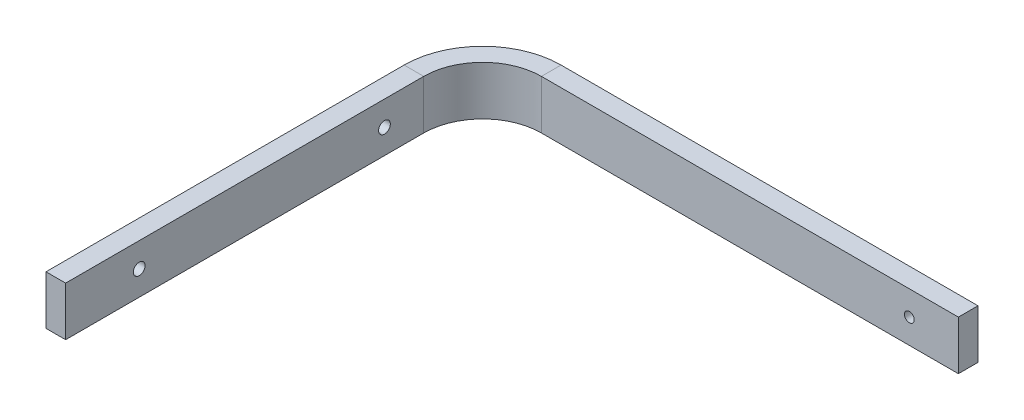
ISO-10303-21;
HEADER;
FILE_DESCRIPTION(('STEP AP214'),'2;1');
FILE_NAME('part.step','',(''),(''),'','','');
FILE_SCHEMA(('AUTOMOTIVE_DESIGN { 1 0 10303 214 1 1 1 1 }'));
ENDSEC;
DATA;
#1=APPLICATION_CONTEXT('core data for automotive mechanical design processes');
#2=APPLICATION_PROTOCOL_DEFINITION('international standard','automotive_design',2000,#1);
#3=PRODUCT_CONTEXT('',#1,'mechanical');
#4=PRODUCT('Part','Part','',(#3));
#5=PRODUCT_RELATED_PRODUCT_CATEGORY('part','',(#4));
#6=PRODUCT_DEFINITION_FORMATION('','',#4);
#7=PRODUCT_DEFINITION_CONTEXT('part definition',#1,'design');
#8=PRODUCT_DEFINITION('design','',#6,#7);
#9=PRODUCT_DEFINITION_SHAPE('','',#8);
#10=(LENGTH_UNIT() NAMED_UNIT(*) SI_UNIT(.MILLI.,.METRE.));
#11=(NAMED_UNIT(*) PLANE_ANGLE_UNIT() SI_UNIT($,.RADIAN.));
#12=(NAMED_UNIT(*) SI_UNIT($,.STERADIAN.) SOLID_ANGLE_UNIT());
#13=UNCERTAINTY_MEASURE_WITH_UNIT(LENGTH_MEASURE(1.E-05),#10,'distance_accuracy_value','');
#14=(GEOMETRIC_REPRESENTATION_CONTEXT(3) GLOBAL_UNCERTAINTY_ASSIGNED_CONTEXT((#13)) GLOBAL_UNIT_ASSIGNED_CONTEXT((#10,
#11,#12)) REPRESENTATION_CONTEXT('',''));
#15=CARTESIAN_POINT('',(0.,0.,0.));
#16=DIRECTION('',(0.,0.,1.));
#17=DIRECTION('',(1.,0.,0.));
#18=AXIS2_PLACEMENT_3D('',#15,#16,#17);
#19=CARTESIAN_POINT('',(-252.51106428109,-12.4999999999999,-227.488935718911));
#20=DIRECTION('',(-1.,0.,0.));
#21=DIRECTION('',(0.,0.,1.));
#22=AXIS2_PLACEMENT_3D('',#19,#20,#21);
#23=PLANE('',#22);
#24=CARTESIAN_POINT('',(-252.511064281089,0.,185.000000000001));
#25=DIRECTION('',(1.,0.,0.));
#26=DIRECTION('',(0.,0.,-1.));
#27=AXIS2_PLACEMENT_3D('',#24,#25,#26);
#28=CIRCLE('',#27,2.99999999999999);
#29=CARTESIAN_POINT('',(-252.511064281089,0.,182.000000000001));
#30=VERTEX_POINT('',#29);
#31=EDGE_CURVE('E199',#30,#30,#28,.T.);
#32=ORIENTED_EDGE('',*,*,#31,.T.);
#33=EDGE_LOOP('',(#32));
#34=FACE_BOUND('',#33,.T.);
#35=DIRECTION('',(0.,0.,1.));
#36=VECTOR('',#35,1.);
#37=CARTESIAN_POINT('',(-252.51106428109,12.4999999999999,-227.488935718911));
#38=LINE('',#37,#36);
#39=CARTESIAN_POINT('',(-252.511064281089,12.5,40.0000000000001));
#40=VERTEX_POINT('',#39);
#41=CARTESIAN_POINT('',(-252.511064281089,12.5,222.511064281089));
#42=VERTEX_POINT('',#41);
#43=EDGE_CURVE('E172',#40,#42,#38,.T.);
#44=ORIENTED_EDGE('',*,*,#43,.F.);
#45=DIRECTION('',(0.,-1.,0.));
#46=VECTOR('',#45,1.);
#47=CARTESIAN_POINT('',(-252.511064281089,-12.4999999999999,40.0000000000001));
#48=LINE('',#47,#46);
#49=CARTESIAN_POINT('',(-252.511064281089,-12.5,40.0000000000002));
#50=VERTEX_POINT('',#49);
#51=EDGE_CURVE('E11',#40,#50,#48,.T.);
#52=ORIENTED_EDGE('',*,*,#51,.T.);
#53=DIRECTION('',(0.,0.,-1.));
#54=VECTOR('',#53,1.);
#55=CARTESIAN_POINT('',(-252.51106428109,-12.4999999999999,-227.488935718911));
#56=LINE('',#55,#54);
#57=CARTESIAN_POINT('',(-252.511064281089,-12.5,222.511064281089));
#58=VERTEX_POINT('',#57);
#59=EDGE_CURVE('E171',#58,#50,#56,.T.);
#60=ORIENTED_EDGE('',*,*,#59,.F.);
#61=DIRECTION('',(0.,-1.,0.));
#62=VECTOR('',#61,1.);
#63=CARTESIAN_POINT('',(-252.511064281089,12.5,222.511064281089));
#64=LINE('',#63,#62);
#65=EDGE_CURVE('E169',#42,#58,#64,.T.);
#66=ORIENTED_EDGE('',*,*,#65,.F.);
#67=EDGE_LOOP('',(#44,#52,#60,#66));
#68=FACE_BOUND('',#67,.T.);
#69=CARTESIAN_POINT('',(-252.51106428109,0.,60.0000000000009));
#70=DIRECTION('',(1.,0.,0.));
#71=DIRECTION('',(0.,0.,-1.));
#72=AXIS2_PLACEMENT_3D('',#69,#70,#71);
#73=CIRCLE('',#72,3.00000000000001);
#74=CARTESIAN_POINT('',(-252.51106428109,0.,57.0000000000009));
#75=VERTEX_POINT('',#74);
#76=EDGE_CURVE('E205',#75,#75,#73,.T.);
#77=ORIENTED_EDGE('',*,*,#76,.T.);
#78=EDGE_LOOP('',(#77));
#79=FACE_BOUND('',#78,.T.);
#80=ADVANCED_FACE('F43',(#34,#68,#79),#23,.T.);
#81=CARTESIAN_POINT('',(-242.51106428109,-12.4999999999999,-227.488935718911));
#82=DIRECTION('',(-1.,0.,0.));
#83=DIRECTION('',(0.,0.,1.));
#84=AXIS2_PLACEMENT_3D('',#81,#82,#83);
#85=PLANE('',#84);
#86=DIRECTION('',(0.,-1.,0.));
#87=VECTOR('',#86,1.);
#88=CARTESIAN_POINT('',(-242.511064281089,-12.4999999999999,40.0000000000001));
#89=LINE('',#88,#87);
#90=CARTESIAN_POINT('',(-242.511064281089,12.5,40.0000000000001));
#91=VERTEX_POINT('',#90);
#92=CARTESIAN_POINT('',(-242.511064281089,-12.5,40.0000000000001));
#93=VERTEX_POINT('',#92);
#94=EDGE_CURVE('E52',#91,#93,#89,.T.);
#95=ORIENTED_EDGE('',*,*,#94,.F.);
#96=DIRECTION('',(0.,0.,1.));
#97=VECTOR('',#96,1.);
#98=CARTESIAN_POINT('',(-242.51106428109,12.4999999999999,-227.488935718911));
#99=LINE('',#98,#97);
#100=CARTESIAN_POINT('',(-242.511064281089,12.5,222.511064281089));
#101=VERTEX_POINT('',#100);
#102=EDGE_CURVE('E47',#91,#101,#99,.T.);
#103=ORIENTED_EDGE('',*,*,#102,.T.);
#104=DIRECTION('',(0.,-1.,0.));
#105=VECTOR('',#104,1.);
#106=CARTESIAN_POINT('',(-242.511064281089,12.5,222.511064281089));
#107=LINE('',#106,#105);
#108=CARTESIAN_POINT('',(-242.511064281089,-12.5,222.511064281089));
#109=VERTEX_POINT('',#108);
#110=EDGE_CURVE('E166',#101,#109,#107,.T.);
#111=ORIENTED_EDGE('',*,*,#110,.T.);
#112=DIRECTION('',(0.,0.,-1.));
#113=VECTOR('',#112,1.);
#114=CARTESIAN_POINT('',(-242.51106428109,-12.4999999999999,-227.488935718911));
#115=LINE('',#114,#113);
#116=EDGE_CURVE('E168',#109,#93,#115,.T.);
#117=ORIENTED_EDGE('',*,*,#116,.T.);
#118=EDGE_LOOP('',(#95,#103,#111,#117));
#119=FACE_BOUND('',#118,.T.);
#120=CARTESIAN_POINT('',(-242.511064281089,0.,185.000000000001));
#121=DIRECTION('',(1.,0.,0.));
#122=DIRECTION('',(0.,0.,-1.));
#123=AXIS2_PLACEMENT_3D('',#120,#121,#122);
#124=CIRCLE('',#123,2.99999999999999);
#125=CARTESIAN_POINT('',(-242.511064281089,0.,182.000000000001));
#126=VERTEX_POINT('',#125);
#127=EDGE_CURVE('E195',#126,#126,#124,.T.);
#128=ORIENTED_EDGE('',*,*,#127,.F.);
#129=EDGE_LOOP('',(#128));
#130=FACE_BOUND('',#129,.T.);
#131=CARTESIAN_POINT('',(-242.51106428109,0.,60.0000000000008));
#132=DIRECTION('',(1.,0.,0.));
#133=DIRECTION('',(0.,0.,-1.));
#134=AXIS2_PLACEMENT_3D('',#131,#132,#133);
#135=CIRCLE('',#134,3.00000000000001);
#136=CARTESIAN_POINT('',(-242.51106428109,0.,57.0000000000008));
#137=VERTEX_POINT('',#136);
#138=EDGE_CURVE('E202',#137,#137,#135,.T.);
#139=ORIENTED_EDGE('',*,*,#138,.F.);
#140=EDGE_LOOP('',(#139));
#141=FACE_BOUND('',#140,.T.);
#142=ADVANCED_FACE('F184',(#119,#130,#141),#85,.F.);
#143=CARTESIAN_POINT('',(-242.51106428109,12.4999999999999,-227.488935718911));
#144=DIRECTION('',(0.,-1.,0.));
#145=DIRECTION('',(0.,0.,-1.));
#146=AXIS2_PLACEMENT_3D('',#143,#144,#145);
#147=PLANE('',#146);
#148=DIRECTION('',(1.,0.,0.));
#149=VECTOR('',#148,1.);
#150=CARTESIAN_POINT('',(-242.511064281089,12.5,40.0000000000001));
#151=LINE('',#150,#149);
#152=EDGE_CURVE('E179',#40,#91,#151,.T.);
#153=ORIENTED_EDGE('',*,*,#152,.F.);
#154=ORIENTED_EDGE('',*,*,#43,.T.);
#155=DIRECTION('',(-1.,0.,0.));
#156=VECTOR('',#155,1.);
#157=CARTESIAN_POINT('',(-242.511064281089,12.5,222.511064281089));
#158=LINE('',#157,#156);
#159=EDGE_CURVE('E176',#101,#42,#158,.T.);
#160=ORIENTED_EDGE('',*,*,#159,.F.);
#161=ORIENTED_EDGE('',*,*,#102,.F.);
#162=EDGE_LOOP('',(#153,#154,#160,#161));
#163=FACE_BOUND('',#162,.T.);
#164=ADVANCED_FACE('F45',(#163),#147,.F.);
#165=CARTESIAN_POINT('',(-242.511064281089,12.5,222.511064281089));
#166=DIRECTION('',(0.,0.,-1.));
#167=DIRECTION('',(-1.,0.,0.));
#168=AXIS2_PLACEMENT_3D('',#165,#166,#167);
#169=PLANE('',#168);
#170=ORIENTED_EDGE('',*,*,#65,.T.);
#171=DIRECTION('',(-1.,0.,0.));
#172=VECTOR('',#171,1.);
#173=CARTESIAN_POINT('',(-242.511064281089,-12.5,222.511064281089));
#174=LINE('',#173,#172);
#175=EDGE_CURVE('E173',#109,#58,#174,.T.);
#176=ORIENTED_EDGE('',*,*,#175,.F.);
#177=ORIENTED_EDGE('',*,*,#110,.F.);
#178=ORIENTED_EDGE('',*,*,#159,.T.);
#179=EDGE_LOOP('',(#170,#176,#177,#178));
#180=FACE_BOUND('',#179,.T.);
#181=ADVANCED_FACE('F252',(#180),#169,.F.);
#182=CARTESIAN_POINT('',(-242.51106428109,-12.4999999999999,-227.488935718911));
#183=DIRECTION('',(0.,1.,0.));
#184=DIRECTION('',(0.,0.,1.));
#185=AXIS2_PLACEMENT_3D('',#182,#183,#184);
#186=PLANE('',#185);
#187=DIRECTION('',(-1.,0.,0.));
#188=VECTOR('',#187,1.);
#189=CARTESIAN_POINT('',(-242.511064281089,-12.5,40.0000000000001));
#190=LINE('',#189,#188);
#191=EDGE_CURVE('E60',#93,#50,#190,.T.);
#192=ORIENTED_EDGE('',*,*,#191,.F.);
#193=ORIENTED_EDGE('',*,*,#116,.F.);
#194=ORIENTED_EDGE('',*,*,#175,.T.);
#195=ORIENTED_EDGE('',*,*,#59,.T.);
#196=EDGE_LOOP('',(#192,#193,#194,#195));
#197=FACE_BOUND('',#196,.T.);
#198=ADVANCED_FACE('F250',(#197),#186,.F.);
#199=CARTESIAN_POINT('',(0.,12.4999999999999,10.));
#200=DIRECTION('',(-1.,0.,0.));
#201=DIRECTION('',(0.,0.,1.));
#202=AXIS2_PLACEMENT_3D('',#199,#200,#201);
#203=PLANE('',#202);
#204=DIRECTION('',(0.,1.,0.));
#205=VECTOR('',#204,1.);
#206=CARTESIAN_POINT('',(0.,12.4999999999999,0.));
#207=LINE('',#206,#205);
#208=CARTESIAN_POINT('',(0.,-12.4999999999999,0.));
#209=VERTEX_POINT('',#208);
#210=CARTESIAN_POINT('',(0.,12.4999999999999,0.));
#211=VERTEX_POINT('',#210);
#212=EDGE_CURVE('E141',#209,#211,#207,.T.);
#213=ORIENTED_EDGE('',*,*,#212,.T.);
#214=DIRECTION('',(0.,0.,-1.));
#215=VECTOR('',#214,1.);
#216=CARTESIAN_POINT('',(0.,12.4999999999999,10.));
#217=LINE('',#216,#215);
#218=CARTESIAN_POINT('',(0.,12.4999999999999,10.));
#219=VERTEX_POINT('',#218);
#220=EDGE_CURVE('E121',#219,#211,#217,.T.);
#221=ORIENTED_EDGE('',*,*,#220,.F.);
#222=DIRECTION('',(0.,1.,0.));
#223=VECTOR('',#222,1.);
#224=CARTESIAN_POINT('',(0.,12.4999999999999,10.));
#225=LINE('',#224,#223);
#226=CARTESIAN_POINT('',(0.,-12.4999999999999,10.));
#227=VERTEX_POINT('',#226);
#228=EDGE_CURVE('E152',#227,#219,#225,.T.);
#229=ORIENTED_EDGE('',*,*,#228,.F.);
#230=DIRECTION('',(0.,0.,-1.));
#231=VECTOR('',#230,1.);
#232=CARTESIAN_POINT('',(0.,-12.4999999999999,10.));
#233=LINE('',#232,#231);
#234=EDGE_CURVE('E162',#227,#209,#233,.T.);
#235=ORIENTED_EDGE('',*,*,#234,.T.);
#236=EDGE_LOOP('',(#213,#221,#229,#235));
#237=FACE_BOUND('',#236,.T.);
#238=ADVANCED_FACE('F229',(#237),#203,.F.);
#239=CARTESIAN_POINT('',(0.,-12.4999999999999,10.));
#240=DIRECTION('',(0.,0.,-1.));
#241=DIRECTION('',(-1.,0.,0.));
#242=AXIS2_PLACEMENT_3D('',#239,#240,#241);
#243=PLANE('',#242);
#244=CARTESIAN_POINT('',(-25.,0.,10.));
#245=DIRECTION('',(0.,0.,1.));
#246=DIRECTION('',(1.,0.,0.));
#247=AXIS2_PLACEMENT_3D('',#244,#245,#246);
#248=CIRCLE('',#247,2.5);
#249=CARTESIAN_POINT('',(-22.5,0.,10.));
#250=VERTEX_POINT('',#249);
#251=EDGE_CURVE('E211',#250,#250,#248,.T.);
#252=ORIENTED_EDGE('',*,*,#251,.F.);
#253=EDGE_LOOP('',(#252));
#254=FACE_BOUND('',#253,.T.);
#255=DIRECTION('',(-1.,0.,0.));
#256=VECTOR('',#255,1.);
#257=CARTESIAN_POINT('',(0.,12.4999999999999,10.));
#258=LINE('',#257,#256);
#259=CARTESIAN_POINT('',(-212.511064281089,12.5,9.99999999999999));
#260=VERTEX_POINT('',#259);
#261=EDGE_CURVE('E160',#219,#260,#258,.T.);
#262=ORIENTED_EDGE('',*,*,#261,.T.);
#263=DIRECTION('',(0.,-1.,0.));
#264=VECTOR('',#263,1.);
#265=CARTESIAN_POINT('',(-212.511064281089,-12.4999999999999,10.));
#266=LINE('',#265,#264);
#267=CARTESIAN_POINT('',(-212.511064281089,-12.5,9.99999999999999));
#268=VERTEX_POINT('',#267);
#269=EDGE_CURVE('E157',#260,#268,#266,.T.);
#270=ORIENTED_EDGE('',*,*,#269,.T.);
#271=DIRECTION('',(1.,0.,0.));
#272=VECTOR('',#271,1.);
#273=CARTESIAN_POINT('',(0.,-12.4999999999999,10.));
#274=LINE('',#273,#272);
#275=EDGE_CURVE('E155',#268,#227,#274,.T.);
#276=ORIENTED_EDGE('',*,*,#275,.T.);
#277=ORIENTED_EDGE('',*,*,#228,.T.);
#278=EDGE_LOOP('',(#262,#270,#276,#277));
#279=FACE_BOUND('',#278,.T.);
#280=ADVANCED_FACE('F225',(#254,#279),#243,.F.);
#281=CARTESIAN_POINT('',(0.,-12.4999999999999,10.));
#282=DIRECTION('',(0.,1.,0.));
#283=DIRECTION('',(-1.,0.,0.));
#284=AXIS2_PLACEMENT_3D('',#281,#282,#283);
#285=PLANE('',#284);
#286=ORIENTED_EDGE('',*,*,#275,.F.);
#287=DIRECTION('',(0.,0.,-1.));
#288=VECTOR('',#287,1.);
#289=CARTESIAN_POINT('',(-212.511064281089,-12.5,10.));
#290=LINE('',#289,#288);
#291=CARTESIAN_POINT('',(-212.511064281089,-12.5,0.));
#292=VERTEX_POINT('',#291);
#293=EDGE_CURVE('E147',#268,#292,#290,.T.);
#294=ORIENTED_EDGE('',*,*,#293,.T.);
#295=DIRECTION('',(1.,0.,0.));
#296=VECTOR('',#295,1.);
#297=CARTESIAN_POINT('',(0.,-12.4999999999999,0.));
#298=LINE('',#297,#296);
#299=EDGE_CURVE('E140',#292,#209,#298,.T.);
#300=ORIENTED_EDGE('',*,*,#299,.T.);
#301=ORIENTED_EDGE('',*,*,#234,.F.);
#302=EDGE_LOOP('',(#286,#294,#300,#301));
#303=FACE_BOUND('',#302,.T.);
#304=ADVANCED_FACE('F228',(#303),#285,.F.);
#305=CARTESIAN_POINT('',(0.,-12.4999999999999,0.));
#306=DIRECTION('',(0.,0.,-1.));
#307=DIRECTION('',(-1.,0.,0.));
#308=AXIS2_PLACEMENT_3D('',#305,#306,#307);
#309=PLANE('',#308);
#310=CARTESIAN_POINT('',(-25.,0.,0.));
#311=DIRECTION('',(0.,0.,1.));
#312=DIRECTION('',(1.,0.,0.));
#313=AXIS2_PLACEMENT_3D('',#310,#311,#312);
#314=CIRCLE('',#313,2.5);
#315=CARTESIAN_POINT('',(-22.5,0.,0.));
#316=VERTEX_POINT('',#315);
#317=EDGE_CURVE('E208',#316,#316,#314,.T.);
#318=ORIENTED_EDGE('',*,*,#317,.T.);
#319=EDGE_LOOP('',(#318));
#320=FACE_BOUND('',#319,.T.);
#321=DIRECTION('',(0.,-1.,0.));
#322=VECTOR('',#321,1.);
#323=CARTESIAN_POINT('',(-212.511064281089,-12.4999999999999,0.));
#324=LINE('',#323,#322);
#325=CARTESIAN_POINT('',(-212.511064281089,12.5,0.));
#326=VERTEX_POINT('',#325);
#327=EDGE_CURVE('E130',#326,#292,#324,.T.);
#328=ORIENTED_EDGE('',*,*,#327,.F.);
#329=DIRECTION('',(-1.,0.,0.));
#330=VECTOR('',#329,1.);
#331=CARTESIAN_POINT('',(0.,12.4999999999999,0.));
#332=LINE('',#331,#330);
#333=EDGE_CURVE('E122',#211,#326,#332,.T.);
#334=ORIENTED_EDGE('',*,*,#333,.F.);
#335=ORIENTED_EDGE('',*,*,#212,.F.);
#336=ORIENTED_EDGE('',*,*,#299,.F.);
#337=EDGE_LOOP('',(#328,#334,#335,#336));
#338=FACE_BOUND('',#337,.T.);
#339=ADVANCED_FACE('F137',(#320,#338),#309,.T.);
#340=CARTESIAN_POINT('',(0.,12.4999999999999,10.));
#341=DIRECTION('',(0.,-1.,0.));
#342=DIRECTION('',(1.,0.,0.));
#343=AXIS2_PLACEMENT_3D('',#340,#341,#342);
#344=PLANE('',#343);
#345=ORIENTED_EDGE('',*,*,#333,.T.);
#346=DIRECTION('',(0.,0.,1.));
#347=VECTOR('',#346,1.);
#348=CARTESIAN_POINT('',(-212.511064281089,12.5,10.));
#349=LINE('',#348,#347);
#350=EDGE_CURVE('E111',#326,#260,#349,.T.);
#351=ORIENTED_EDGE('',*,*,#350,.T.);
#352=ORIENTED_EDGE('',*,*,#261,.F.);
#353=ORIENTED_EDGE('',*,*,#220,.T.);
#354=EDGE_LOOP('',(#345,#351,#352,#353));
#355=FACE_BOUND('',#354,.T.);
#356=ADVANCED_FACE('F143',(#355),#344,.F.);
#357=CARTESIAN_POINT('',(-212.511064281089,12.5,40.));
#358=DIRECTION('',(0.,-1.,0.));
#359=DIRECTION('',(1.,0.,0.));
#360=AXIS2_PLACEMENT_3D('',#357,#358,#359);
#361=PLANE('',#360);
#362=ORIENTED_EDGE('',*,*,#152,.T.);
#363=CARTESIAN_POINT('',(-212.511064281089,12.5,40.));
#364=DIRECTION('',(0.,-1.,0.));
#365=DIRECTION('',(0.,0.,-1.));
#366=AXIS2_PLACEMENT_3D('',#363,#364,#365);
#367=CIRCLE('',#366,30.);
#368=EDGE_CURVE('E117',#260,#91,#367,.F.);
#369=ORIENTED_EDGE('',*,*,#368,.F.);
#370=ORIENTED_EDGE('',*,*,#350,.F.);
#371=CARTESIAN_POINT('',(-212.511064281089,12.5,40.));
#372=DIRECTION('',(0.,-1.,0.));
#373=DIRECTION('',(0.,0.,-1.));
#374=AXIS2_PLACEMENT_3D('',#371,#372,#373);
#375=CIRCLE('',#374,40.);
#376=EDGE_CURVE('E115',#326,#40,#375,.F.);
#377=ORIENTED_EDGE('',*,*,#376,.T.);
#378=EDGE_LOOP('',(#362,#369,#370,#377));
#379=FACE_BOUND('',#378,.T.);
#380=ADVANCED_FACE('F114',(#379),#361,.F.);
#381=CARTESIAN_POINT('',(-212.511064281089,-12.5,40.));
#382=DIRECTION('',(0.,1.,0.));
#383=DIRECTION('',(-1.,0.,0.));
#384=AXIS2_PLACEMENT_3D('',#381,#382,#383);
#385=PLANE('',#384);
#386=ORIENTED_EDGE('',*,*,#293,.F.);
#387=CARTESIAN_POINT('',(-212.511064281089,-12.5,40.));
#388=DIRECTION('',(0.,-1.,0.));
#389=DIRECTION('',(0.,0.,-1.));
#390=AXIS2_PLACEMENT_3D('',#387,#388,#389);
#391=CIRCLE('',#390,30.);
#392=EDGE_CURVE('E133',#93,#268,#391,.T.);
#393=ORIENTED_EDGE('',*,*,#392,.F.);
#394=ORIENTED_EDGE('',*,*,#191,.T.);
#395=CARTESIAN_POINT('',(-212.511064281089,-12.5,40.));
#396=DIRECTION('',(0.,-1.,0.));
#397=DIRECTION('',(0.,0.,-1.));
#398=AXIS2_PLACEMENT_3D('',#395,#396,#397);
#399=CIRCLE('',#398,40.);
#400=EDGE_CURVE('E132',#50,#292,#399,.T.);
#401=ORIENTED_EDGE('',*,*,#400,.T.);
#402=EDGE_LOOP('',(#386,#393,#394,#401));
#403=FACE_BOUND('',#402,.T.);
#404=ADVANCED_FACE('F193',(#403),#385,.F.);
#405=CARTESIAN_POINT('',(-212.511064281089,463.304835821445,40.));
#406=DIRECTION('',(0.,-1.,0.));
#407=DIRECTION('',(0.,0.,-1.));
#408=AXIS2_PLACEMENT_3D('',#405,#406,#407);
#409=CYLINDRICAL_SURFACE('',#408,40.);
#410=ORIENTED_EDGE('',*,*,#400,.F.);
#411=ORIENTED_EDGE('',*,*,#51,.F.);
#412=ORIENTED_EDGE('',*,*,#376,.F.);
#413=ORIENTED_EDGE('',*,*,#327,.T.);
#414=EDGE_LOOP('',(#410,#411,#412,#413));
#415=FACE_BOUND('',#414,.T.);
#416=ADVANCED_FACE('F129',(#415),#409,.T.);
#417=CARTESIAN_POINT('',(-212.511064281089,463.304835821445,40.));
#418=DIRECTION('',(0.,-1.,0.));
#419=DIRECTION('',(0.,0.,-1.));
#420=AXIS2_PLACEMENT_3D('',#417,#418,#419);
#421=CYLINDRICAL_SURFACE('',#420,30.);
#422=ORIENTED_EDGE('',*,*,#392,.T.);
#423=ORIENTED_EDGE('',*,*,#269,.F.);
#424=ORIENTED_EDGE('',*,*,#368,.T.);
#425=ORIENTED_EDGE('',*,*,#94,.T.);
#426=EDGE_LOOP('',(#422,#423,#424,#425));
#427=FACE_BOUND('',#426,.T.);
#428=ADVANCED_FACE('F191',(#427),#421,.F.);
#429=CARTESIAN_POINT('',(-252.511064281089,0.,185.000000000001));
#430=DIRECTION('',(1.,0.,0.));
#431=DIRECTION('',(0.,0.,-1.));
#432=AXIS2_PLACEMENT_3D('',#429,#430,#431);
#433=CYLINDRICAL_SURFACE('',#432,2.99999999999999);
#434=ORIENTED_EDGE('',*,*,#127,.T.);
#435=EDGE_LOOP('',(#434));
#436=FACE_BOUND('',#435,.T.);
#437=ORIENTED_EDGE('',*,*,#31,.F.);
#438=EDGE_LOOP('',(#437));
#439=FACE_BOUND('',#438,.T.);
#440=ADVANCED_FACE('F306',(#436,#439),#433,.F.);
#441=CARTESIAN_POINT('',(-252.51106428109,0.,60.0000000000009));
#442=DIRECTION('',(1.,0.,0.));
#443=DIRECTION('',(0.,0.,-1.));
#444=AXIS2_PLACEMENT_3D('',#441,#442,#443);
#445=CYLINDRICAL_SURFACE('',#444,3.00000000000001);
#446=ORIENTED_EDGE('',*,*,#138,.T.);
#447=EDGE_LOOP('',(#446));
#448=FACE_BOUND('',#447,.T.);
#449=ORIENTED_EDGE('',*,*,#76,.F.);
#450=EDGE_LOOP('',(#449));
#451=FACE_BOUND('',#450,.T.);
#452=ADVANCED_FACE('F221',(#448,#451),#445,.F.);
#453=CARTESIAN_POINT('',(-25.,0.,0.));
#454=DIRECTION('',(0.,0.,1.));
#455=DIRECTION('',(1.,0.,0.));
#456=AXIS2_PLACEMENT_3D('',#453,#454,#455);
#457=CYLINDRICAL_SURFACE('',#456,2.5);
#458=ORIENTED_EDGE('',*,*,#317,.F.);
#459=EDGE_LOOP('',(#458));
#460=FACE_BOUND('',#459,.T.);
#461=ORIENTED_EDGE('',*,*,#251,.T.);
#462=EDGE_LOOP('',(#461));
#463=FACE_BOUND('',#462,.T.);
#464=ADVANCED_FACE('F218',(#460,#463),#457,.F.);
#465=CLOSED_SHELL('',(#80,#142,#164,#181,#198,#238,#280,#304,#339,#356,#380,#404,#416,#428,#440,
#452,#464));
#466=MANIFOLD_SOLID_BREP('B2',#465);
#467=ADVANCED_BREP_SHAPE_REPRESENTATION('',(#18,#466),#14);
#468=SHAPE_DEFINITION_REPRESENTATION(#9,#467);
ENDSEC;
END-ISO-10303-21;
